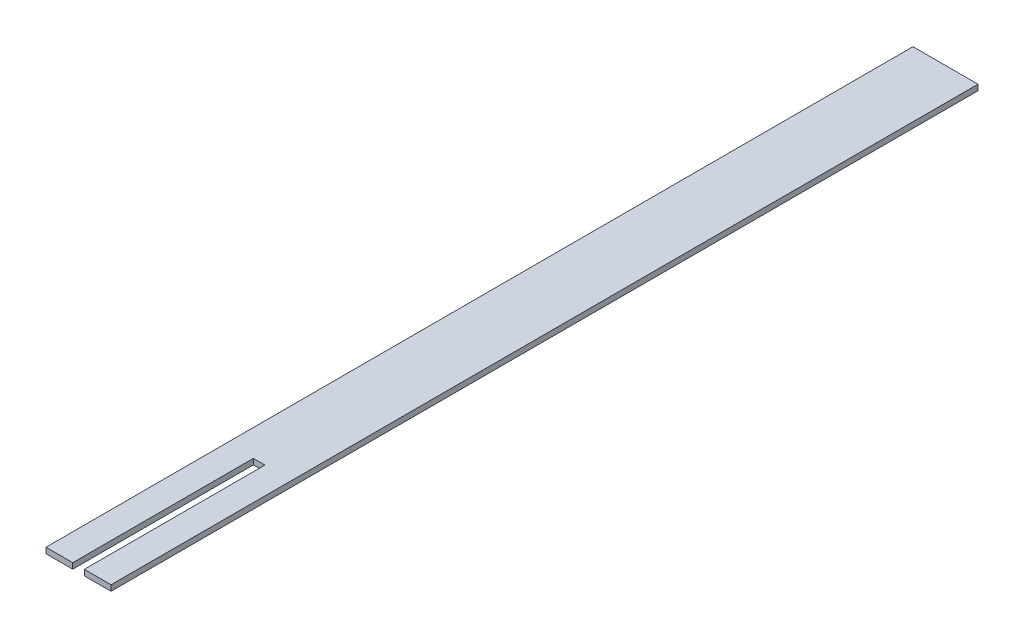
ISO-10303-21;
HEADER;
FILE_DESCRIPTION(('STEP AP214'),'2;1');
FILE_NAME('part.step','',(''),(''),'','','');
FILE_SCHEMA(('AUTOMOTIVE_DESIGN { 1 0 10303 214 1 1 1 1 }'));
ENDSEC;
DATA;
#1=APPLICATION_CONTEXT('core data for automotive mechanical design processes');
#2=APPLICATION_PROTOCOL_DEFINITION('international standard','automotive_design',2000,#1);
#3=PRODUCT_CONTEXT('',#1,'mechanical');
#4=PRODUCT('Part','Part','',(#3));
#5=PRODUCT_RELATED_PRODUCT_CATEGORY('part','',(#4));
#6=PRODUCT_DEFINITION_FORMATION('','',#4);
#7=PRODUCT_DEFINITION_CONTEXT('part definition',#1,'design');
#8=PRODUCT_DEFINITION('design','',#6,#7);
#9=PRODUCT_DEFINITION_SHAPE('','',#8);
#10=(LENGTH_UNIT() NAMED_UNIT(*) SI_UNIT(.MILLI.,.METRE.));
#11=(NAMED_UNIT(*) PLANE_ANGLE_UNIT() SI_UNIT($,.RADIAN.));
#12=(NAMED_UNIT(*) SI_UNIT($,.STERADIAN.) SOLID_ANGLE_UNIT());
#13=UNCERTAINTY_MEASURE_WITH_UNIT(LENGTH_MEASURE(1.E-05),#10,'distance_accuracy_value','');
#14=(GEOMETRIC_REPRESENTATION_CONTEXT(3) GLOBAL_UNCERTAINTY_ASSIGNED_CONTEXT((#13)) GLOBAL_UNIT_ASSIGNED_CONTEXT((#10,
#11,#12)) REPRESENTATION_CONTEXT('',''));
#15=CARTESIAN_POINT('',(0.,0.,0.));
#16=DIRECTION('',(0.,0.,1.));
#17=DIRECTION('',(1.,0.,0.));
#18=AXIS2_PLACEMENT_3D('',#15,#16,#17);
#19=CARTESIAN_POINT('',(23.495,5.,762.));
#20=DIRECTION('',(0.,0.,1.));
#21=DIRECTION('',(1.,0.,0.));
#22=AXIS2_PLACEMENT_3D('',#19,#20,#21);
#23=PLANE('',#22);
#24=DIRECTION('',(-1.,0.,0.));
#25=VECTOR('',#24,1.);
#26=CARTESIAN_POINT('',(23.495,0.,762.));
#27=LINE('',#26,#25);
#28=CARTESIAN_POINT('',(23.495,0.,762.));
#29=VERTEX_POINT('',#28);
#30=CARTESIAN_POINT('',(0.,0.,762.));
#31=VERTEX_POINT('',#30);
#32=EDGE_CURVE('E144',#29,#31,#27,.T.);
#33=ORIENTED_EDGE('',*,*,#32,.F.);
#34=DIRECTION('',(0.,-1.,0.));
#35=VECTOR('',#34,1.);
#36=CARTESIAN_POINT('',(23.495,5.,762.));
#37=LINE('',#36,#35);
#38=CARTESIAN_POINT('',(23.495,5.,762.));
#39=VERTEX_POINT('',#38);
#40=EDGE_CURVE('E11',#39,#29,#37,.T.);
#41=ORIENTED_EDGE('',*,*,#40,.F.);
#42=DIRECTION('',(-1.,0.,0.));
#43=VECTOR('',#42,1.);
#44=CARTESIAN_POINT('',(23.495,5.,762.));
#45=LINE('',#44,#43);
#46=CARTESIAN_POINT('',(0.,5.,762.));
#47=VERTEX_POINT('',#46);
#48=EDGE_CURVE('E170',#39,#47,#45,.T.);
#49=ORIENTED_EDGE('',*,*,#48,.T.);
#50=DIRECTION('',(0.,-1.,0.));
#51=VECTOR('',#50,1.);
#52=CARTESIAN_POINT('',(0.,5.,762.));
#53=LINE('',#52,#51);
#54=EDGE_CURVE('E42',#47,#31,#53,.T.);
#55=ORIENTED_EDGE('',*,*,#54,.T.);
#56=EDGE_LOOP('',(#33,#41,#49,#55));
#57=FACE_BOUND('',#56,.T.);
#58=ADVANCED_FACE('F39',(#57),#23,.T.);
#59=CARTESIAN_POINT('',(23.495,5.,762.));
#60=DIRECTION('',(-1.,0.,0.));
#61=DIRECTION('',(0.,0.,1.));
#62=AXIS2_PLACEMENT_3D('',#59,#60,#61);
#63=PLANE('',#62);
#64=DIRECTION('',(0.,0.,-1.));
#65=VECTOR('',#64,1.);
#66=CARTESIAN_POINT('',(23.495,0.,762.));
#67=LINE('',#66,#65);
#68=CARTESIAN_POINT('',(23.495,0.,603.25));
#69=VERTEX_POINT('',#68);
#70=EDGE_CURVE('E85',#29,#69,#67,.T.);
#71=ORIENTED_EDGE('',*,*,#70,.T.);
#72=DIRECTION('',(0.,-1.,0.));
#73=VECTOR('',#72,1.);
#74=CARTESIAN_POINT('',(23.495,5.,603.25));
#75=LINE('',#74,#73);
#76=CARTESIAN_POINT('',(23.495,5.,603.25));
#77=VERTEX_POINT('',#76);
#78=EDGE_CURVE('E49',#77,#69,#75,.T.);
#79=ORIENTED_EDGE('',*,*,#78,.F.);
#80=DIRECTION('',(0.,0.,-1.));
#81=VECTOR('',#80,1.);
#82=CARTESIAN_POINT('',(23.495,5.,762.));
#83=LINE('',#82,#81);
#84=EDGE_CURVE('E117',#39,#77,#83,.T.);
#85=ORIENTED_EDGE('',*,*,#84,.F.);
#86=ORIENTED_EDGE('',*,*,#40,.T.);
#87=EDGE_LOOP('',(#71,#79,#85,#86));
#88=FACE_BOUND('',#87,.T.);
#89=ADVANCED_FACE('F217',(#88),#63,.F.);
#90=CARTESIAN_POINT('',(23.495,5.,603.25));
#91=DIRECTION('',(0.,0.,-1.));
#92=DIRECTION('',(-1.,0.,0.));
#93=AXIS2_PLACEMENT_3D('',#90,#91,#92);
#94=PLANE('',#93);
#95=DIRECTION('',(1.,0.,0.));
#96=VECTOR('',#95,1.);
#97=CARTESIAN_POINT('',(23.495,0.,603.25));
#98=LINE('',#97,#96);
#99=CARTESIAN_POINT('',(33.655,0.,603.25));
#100=VERTEX_POINT('',#99);
#101=EDGE_CURVE('E125',#69,#100,#98,.T.);
#102=ORIENTED_EDGE('',*,*,#101,.T.);
#103=DIRECTION('',(0.,-1.,0.));
#104=VECTOR('',#103,1.);
#105=CARTESIAN_POINT('',(33.655,5.,603.25));
#106=LINE('',#105,#104);
#107=CARTESIAN_POINT('',(33.655,5.,603.25));
#108=VERTEX_POINT('',#107);
#109=EDGE_CURVE('E122',#108,#100,#106,.T.);
#110=ORIENTED_EDGE('',*,*,#109,.F.);
#111=DIRECTION('',(1.,0.,0.));
#112=VECTOR('',#111,1.);
#113=CARTESIAN_POINT('',(23.495,5.,603.25));
#114=LINE('',#113,#112);
#115=EDGE_CURVE('E109',#77,#108,#114,.T.);
#116=ORIENTED_EDGE('',*,*,#115,.F.);
#117=ORIENTED_EDGE('',*,*,#78,.T.);
#118=EDGE_LOOP('',(#102,#110,#116,#117));
#119=FACE_BOUND('',#118,.T.);
#120=ADVANCED_FACE('F123',(#119),#94,.F.);
#121=CARTESIAN_POINT('',(33.655,5.,603.25));
#122=DIRECTION('',(1.,0.,0.));
#123=DIRECTION('',(0.,0.,-1.));
#124=AXIS2_PLACEMENT_3D('',#121,#122,#123);
#125=PLANE('',#124);
#126=DIRECTION('',(0.,0.,1.));
#127=VECTOR('',#126,1.);
#128=CARTESIAN_POINT('',(33.655,0.,603.25));
#129=LINE('',#128,#127);
#130=CARTESIAN_POINT('',(33.655,0.,762.));
#131=VERTEX_POINT('',#130);
#132=EDGE_CURVE('E164',#100,#131,#129,.T.);
#133=ORIENTED_EDGE('',*,*,#132,.T.);
#134=DIRECTION('',(0.,-1.,0.));
#135=VECTOR('',#134,1.);
#136=CARTESIAN_POINT('',(33.655,5.,762.));
#137=LINE('',#136,#135);
#138=CARTESIAN_POINT('',(33.655,5.,762.));
#139=VERTEX_POINT('',#138);
#140=EDGE_CURVE('E130',#139,#131,#137,.T.);
#141=ORIENTED_EDGE('',*,*,#140,.F.);
#142=DIRECTION('',(0.,0.,1.));
#143=VECTOR('',#142,1.);
#144=CARTESIAN_POINT('',(33.655,5.,603.25));
#145=LINE('',#144,#143);
#146=EDGE_CURVE('E115',#108,#139,#145,.T.);
#147=ORIENTED_EDGE('',*,*,#146,.F.);
#148=ORIENTED_EDGE('',*,*,#109,.T.);
#149=EDGE_LOOP('',(#133,#141,#147,#148));
#150=FACE_BOUND('',#149,.T.);
#151=ADVANCED_FACE('F132',(#150),#125,.F.);
#152=CARTESIAN_POINT('',(57.1500000000001,5.,762.));
#153=DIRECTION('',(0.,0.,1.));
#154=DIRECTION('',(1.,0.,0.));
#155=AXIS2_PLACEMENT_3D('',#152,#153,#154);
#156=PLANE('',#155);
#157=DIRECTION('',(-1.,0.,0.));
#158=VECTOR('',#157,1.);
#159=CARTESIAN_POINT('',(57.1500000000001,0.,762.));
#160=LINE('',#159,#158);
#161=CARTESIAN_POINT('',(57.1500000000001,0.,762.));
#162=VERTEX_POINT('',#161);
#163=EDGE_CURVE('E160',#162,#131,#160,.T.);
#164=ORIENTED_EDGE('',*,*,#163,.F.);
#165=DIRECTION('',(0.,-1.,0.));
#166=VECTOR('',#165,1.);
#167=CARTESIAN_POINT('',(57.1500000000001,5.,762.));
#168=LINE('',#167,#166);
#169=CARTESIAN_POINT('',(57.1500000000001,5.,762.));
#170=VERTEX_POINT('',#169);
#171=EDGE_CURVE('E176',#170,#162,#168,.T.);
#172=ORIENTED_EDGE('',*,*,#171,.F.);
#173=DIRECTION('',(-1.,0.,0.));
#174=VECTOR('',#173,1.);
#175=CARTESIAN_POINT('',(57.1500000000001,5.,762.));
#176=LINE('',#175,#174);
#177=EDGE_CURVE('E135',#170,#139,#176,.T.);
#178=ORIENTED_EDGE('',*,*,#177,.T.);
#179=ORIENTED_EDGE('',*,*,#140,.T.);
#180=EDGE_LOOP('',(#164,#172,#178,#179));
#181=FACE_BOUND('',#180,.T.);
#182=ADVANCED_FACE('F191',(#181),#156,.T.);
#183=CARTESIAN_POINT('',(57.15,5.,0.));
#184=DIRECTION('',(1.,0.,0.));
#185=DIRECTION('',(0.,0.,-1.));
#186=AXIS2_PLACEMENT_3D('',#183,#184,#185);
#187=PLANE('',#186);
#188=DIRECTION('',(0.,0.,1.));
#189=VECTOR('',#188,1.);
#190=CARTESIAN_POINT('',(57.15,0.,0.));
#191=LINE('',#190,#189);
#192=CARTESIAN_POINT('',(57.15,0.,0.));
#193=VERTEX_POINT('',#192);
#194=EDGE_CURVE('E156',#193,#162,#191,.T.);
#195=ORIENTED_EDGE('',*,*,#194,.F.);
#196=DIRECTION('',(0.,-1.,0.));
#197=VECTOR('',#196,1.);
#198=CARTESIAN_POINT('',(57.15,5.,0.));
#199=LINE('',#198,#197);
#200=CARTESIAN_POINT('',(57.15,5.,0.));
#201=VERTEX_POINT('',#200);
#202=EDGE_CURVE('E179',#201,#193,#199,.T.);
#203=ORIENTED_EDGE('',*,*,#202,.F.);
#204=DIRECTION('',(0.,0.,1.));
#205=VECTOR('',#204,1.);
#206=CARTESIAN_POINT('',(57.15,5.,0.));
#207=LINE('',#206,#205);
#208=EDGE_CURVE('E138',#201,#170,#207,.T.);
#209=ORIENTED_EDGE('',*,*,#208,.T.);
#210=ORIENTED_EDGE('',*,*,#171,.T.);
#211=EDGE_LOOP('',(#195,#203,#209,#210));
#212=FACE_BOUND('',#211,.T.);
#213=ADVANCED_FACE('F197',(#212),#187,.T.);
#214=CARTESIAN_POINT('',(0.,5.,0.));
#215=DIRECTION('',(0.,0.,-1.));
#216=DIRECTION('',(-1.,0.,0.));
#217=AXIS2_PLACEMENT_3D('',#214,#215,#216);
#218=PLANE('',#217);
#219=DIRECTION('',(1.,0.,0.));
#220=VECTOR('',#219,1.);
#221=CARTESIAN_POINT('',(0.,0.,0.));
#222=LINE('',#221,#220);
#223=CARTESIAN_POINT('',(0.,0.,0.));
#224=VERTEX_POINT('',#223);
#225=EDGE_CURVE('E152',#224,#193,#222,.T.);
#226=ORIENTED_EDGE('',*,*,#225,.F.);
#227=DIRECTION('',(0.,-1.,0.));
#228=VECTOR('',#227,1.);
#229=CARTESIAN_POINT('',(0.,5.,0.));
#230=LINE('',#229,#228);
#231=CARTESIAN_POINT('',(0.,5.,0.));
#232=VERTEX_POINT('',#231);
#233=EDGE_CURVE('E181',#232,#224,#230,.T.);
#234=ORIENTED_EDGE('',*,*,#233,.F.);
#235=DIRECTION('',(1.,0.,0.));
#236=VECTOR('',#235,1.);
#237=CARTESIAN_POINT('',(0.,5.,0.));
#238=LINE('',#237,#236);
#239=EDGE_CURVE('E199',#232,#201,#238,.T.);
#240=ORIENTED_EDGE('',*,*,#239,.T.);
#241=ORIENTED_EDGE('',*,*,#202,.T.);
#242=EDGE_LOOP('',(#226,#234,#240,#241));
#243=FACE_BOUND('',#242,.T.);
#244=ADVANCED_FACE('F208',(#243),#218,.T.);
#245=CARTESIAN_POINT('',(0.,5.,762.));
#246=DIRECTION('',(-1.,0.,0.));
#247=DIRECTION('',(0.,0.,1.));
#248=AXIS2_PLACEMENT_3D('',#245,#246,#247);
#249=PLANE('',#248);
#250=DIRECTION('',(0.,0.,-1.));
#251=VECTOR('',#250,1.);
#252=CARTESIAN_POINT('',(0.,0.,762.));
#253=LINE('',#252,#251);
#254=EDGE_CURVE('E148',#31,#224,#253,.T.);
#255=ORIENTED_EDGE('',*,*,#254,.F.);
#256=ORIENTED_EDGE('',*,*,#54,.F.);
#257=DIRECTION('',(0.,0.,-1.));
#258=VECTOR('',#257,1.);
#259=CARTESIAN_POINT('',(0.,5.,762.));
#260=LINE('',#259,#258);
#261=EDGE_CURVE('E201',#47,#232,#260,.T.);
#262=ORIENTED_EDGE('',*,*,#261,.T.);
#263=ORIENTED_EDGE('',*,*,#233,.T.);
#264=EDGE_LOOP('',(#255,#256,#262,#263));
#265=FACE_BOUND('',#264,.T.);
#266=ADVANCED_FACE('F185',(#265),#249,.T.);
#267=CARTESIAN_POINT('',(0.,5.,0.));
#268=DIRECTION('',(0.,-1.,0.));
#269=DIRECTION('',(0.,0.,-1.));
#270=AXIS2_PLACEMENT_3D('',#267,#268,#269);
#271=PLANE('',#270);
#272=ORIENTED_EDGE('',*,*,#48,.F.);
#273=ORIENTED_EDGE('',*,*,#84,.T.);
#274=ORIENTED_EDGE('',*,*,#115,.T.);
#275=ORIENTED_EDGE('',*,*,#146,.T.);
#276=ORIENTED_EDGE('',*,*,#177,.F.);
#277=ORIENTED_EDGE('',*,*,#208,.F.);
#278=ORIENTED_EDGE('',*,*,#239,.F.);
#279=ORIENTED_EDGE('',*,*,#261,.F.);
#280=EDGE_LOOP('',(#272,#273,#274,#275,#276,#277,#278,#279));
#281=FACE_BOUND('',#280,.T.);
#282=ADVANCED_FACE('F112',(#281),#271,.F.);
#283=CARTESIAN_POINT('',(0.,0.,0.));
#284=DIRECTION('',(0.,-1.,0.));
#285=DIRECTION('',(0.,0.,-1.));
#286=AXIS2_PLACEMENT_3D('',#283,#284,#285);
#287=PLANE('',#286);
#288=ORIENTED_EDGE('',*,*,#32,.T.);
#289=ORIENTED_EDGE('',*,*,#254,.T.);
#290=ORIENTED_EDGE('',*,*,#225,.T.);
#291=ORIENTED_EDGE('',*,*,#194,.T.);
#292=ORIENTED_EDGE('',*,*,#163,.T.);
#293=ORIENTED_EDGE('',*,*,#132,.F.);
#294=ORIENTED_EDGE('',*,*,#101,.F.);
#295=ORIENTED_EDGE('',*,*,#70,.F.);
#296=EDGE_LOOP('',(#288,#289,#290,#291,#292,#293,#294,#295));
#297=FACE_BOUND('',#296,.T.);
#298=ADVANCED_FACE('F187',(#297),#287,.T.);
#299=CLOSED_SHELL('',(#58,#89,#120,#151,#182,#213,#244,#266,#282,#298));
#300=MANIFOLD_SOLID_BREP('B2',#299);
#301=ADVANCED_BREP_SHAPE_REPRESENTATION('',(#18,#300),#14);
#302=SHAPE_DEFINITION_REPRESENTATION(#9,#301);
ENDSEC;
END-ISO-10303-21;
